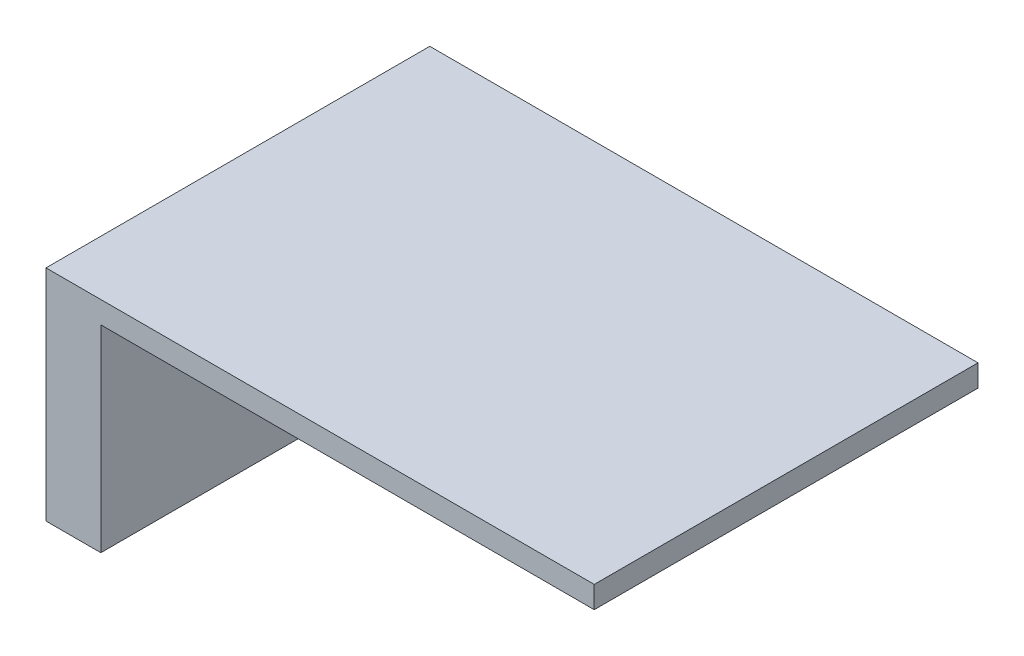
ISO-10303-21;
HEADER;
FILE_DESCRIPTION(('STEP AP214'),'2;1');
FILE_NAME('part.step','',(''),(''),'','','');
FILE_SCHEMA(('AUTOMOTIVE_DESIGN { 1 0 10303 214 1 1 1 1 }'));
ENDSEC;
DATA;
#1=APPLICATION_CONTEXT('core data for automotive mechanical design processes');
#2=APPLICATION_PROTOCOL_DEFINITION('international standard','automotive_design',2000,#1);
#3=PRODUCT_CONTEXT('',#1,'mechanical');
#4=PRODUCT('Part','Part','',(#3));
#5=PRODUCT_RELATED_PRODUCT_CATEGORY('part','',(#4));
#6=PRODUCT_DEFINITION_FORMATION('','',#4);
#7=PRODUCT_DEFINITION_CONTEXT('part definition',#1,'design');
#8=PRODUCT_DEFINITION('design','',#6,#7);
#9=PRODUCT_DEFINITION_SHAPE('','',#8);
#10=(LENGTH_UNIT() NAMED_UNIT(*) SI_UNIT(.MILLI.,.METRE.));
#11=(NAMED_UNIT(*) PLANE_ANGLE_UNIT() SI_UNIT($,.RADIAN.));
#12=(NAMED_UNIT(*) SI_UNIT($,.STERADIAN.) SOLID_ANGLE_UNIT());
#13=UNCERTAINTY_MEASURE_WITH_UNIT(LENGTH_MEASURE(1.E-05),#10,'distance_accuracy_value','');
#14=(GEOMETRIC_REPRESENTATION_CONTEXT(3) GLOBAL_UNCERTAINTY_ASSIGNED_CONTEXT((#13)) GLOBAL_UNIT_ASSIGNED_CONTEXT((#10,
#11,#12)) REPRESENTATION_CONTEXT('',''));
#15=CARTESIAN_POINT('',(0.,0.,0.));
#16=DIRECTION('',(0.,0.,1.));
#17=DIRECTION('',(1.,0.,0.));
#18=AXIS2_PLACEMENT_3D('',#15,#16,#17);
#19=CARTESIAN_POINT('',(2.5,0.,17.5));
#20=DIRECTION('',(0.,1.,0.));
#21=DIRECTION('',(-1.,0.,0.));
#22=AXIS2_PLACEMENT_3D('',#19,#20,#21);
#23=PLANE('',#22);
#24=DIRECTION('',(1.,0.,0.));
#25=VECTOR('',#24,1.);
#26=CARTESIAN_POINT('',(2.5,0.,0.));
#27=LINE('',#26,#25);
#28=CARTESIAN_POINT('',(0.,0.,0.));
#29=VERTEX_POINT('',#28);
#30=CARTESIAN_POINT('',(2.5,0.,0.));
#31=VERTEX_POINT('',#30);
#32=EDGE_CURVE('E116',#29,#31,#27,.T.);
#33=ORIENTED_EDGE('',*,*,#32,.T.);
#34=DIRECTION('',(0.,0.,-1.));
#35=VECTOR('',#34,1.);
#36=CARTESIAN_POINT('',(2.5,0.,17.5));
#37=LINE('',#36,#35);
#38=CARTESIAN_POINT('',(2.5,0.,17.5));
#39=VERTEX_POINT('',#38);
#40=EDGE_CURVE('E11',#39,#31,#37,.T.);
#41=ORIENTED_EDGE('',*,*,#40,.F.);
#42=DIRECTION('',(1.,0.,0.));
#43=VECTOR('',#42,1.);
#44=CARTESIAN_POINT('',(2.5,0.,17.5));
#45=LINE('',#44,#43);
#46=CARTESIAN_POINT('',(0.,0.,17.5));
#47=VERTEX_POINT('',#46);
#48=EDGE_CURVE('E126',#47,#39,#45,.T.);
#49=ORIENTED_EDGE('',*,*,#48,.F.);
#50=DIRECTION('',(0.,0.,-1.));
#51=VECTOR('',#50,1.);
#52=CARTESIAN_POINT('',(0.,0.,17.5));
#53=LINE('',#52,#51);
#54=EDGE_CURVE('E112',#47,#29,#53,.T.);
#55=ORIENTED_EDGE('',*,*,#54,.T.);
#56=EDGE_LOOP('',(#33,#41,#49,#55));
#57=FACE_BOUND('',#56,.T.);
#58=ADVANCED_FACE('F32',(#57),#23,.F.);
#59=CARTESIAN_POINT('',(2.5,9.,17.5));
#60=DIRECTION('',(-1.,0.,0.));
#61=DIRECTION('',(0.,-1.,0.));
#62=AXIS2_PLACEMENT_3D('',#59,#60,#61);
#63=PLANE('',#62);
#64=DIRECTION('',(0.,1.,0.));
#65=VECTOR('',#64,1.);
#66=CARTESIAN_POINT('',(2.5,9.,0.));
#67=LINE('',#66,#65);
#68=CARTESIAN_POINT('',(2.5,9.,0.));
#69=VERTEX_POINT('',#68);
#70=EDGE_CURVE('E119',#31,#69,#67,.T.);
#71=ORIENTED_EDGE('',*,*,#70,.T.);
#72=DIRECTION('',(0.,0.,-1.));
#73=VECTOR('',#72,1.);
#74=CARTESIAN_POINT('',(2.5,9.,17.5));
#75=LINE('',#74,#73);
#76=CARTESIAN_POINT('',(2.5,9.,17.5));
#77=VERTEX_POINT('',#76);
#78=EDGE_CURVE('E40',#77,#69,#75,.T.);
#79=ORIENTED_EDGE('',*,*,#78,.F.);
#80=DIRECTION('',(0.,1.,0.));
#81=VECTOR('',#80,1.);
#82=CARTESIAN_POINT('',(2.5,9.,17.5));
#83=LINE('',#82,#81);
#84=EDGE_CURVE('E85',#39,#77,#83,.T.);
#85=ORIENTED_EDGE('',*,*,#84,.F.);
#86=ORIENTED_EDGE('',*,*,#40,.T.);
#87=EDGE_LOOP('',(#71,#79,#85,#86));
#88=FACE_BOUND('',#87,.T.);
#89=ADVANCED_FACE('F150',(#88),#63,.F.);
#90=CARTESIAN_POINT('',(25.,9.,17.5));
#91=DIRECTION('',(0.,1.,0.));
#92=DIRECTION('',(-1.,0.,0.));
#93=AXIS2_PLACEMENT_3D('',#90,#91,#92);
#94=PLANE('',#93);
#95=DIRECTION('',(1.,0.,0.));
#96=VECTOR('',#95,1.);
#97=CARTESIAN_POINT('',(25.,9.,0.));
#98=LINE('',#97,#96);
#99=CARTESIAN_POINT('',(25.,9.,0.));
#100=VERTEX_POINT('',#99);
#101=EDGE_CURVE('E121',#69,#100,#98,.T.);
#102=ORIENTED_EDGE('',*,*,#101,.T.);
#103=DIRECTION('',(0.,0.,-1.));
#104=VECTOR('',#103,1.);
#105=CARTESIAN_POINT('',(25.,9.,17.5));
#106=LINE('',#105,#104);
#107=CARTESIAN_POINT('',(25.,9.,17.5));
#108=VERTEX_POINT('',#107);
#109=EDGE_CURVE('E107',#108,#100,#106,.T.);
#110=ORIENTED_EDGE('',*,*,#109,.F.);
#111=DIRECTION('',(1.,0.,0.));
#112=VECTOR('',#111,1.);
#113=CARTESIAN_POINT('',(25.,9.,17.5));
#114=LINE('',#113,#112);
#115=EDGE_CURVE('E98',#77,#108,#114,.T.);
#116=ORIENTED_EDGE('',*,*,#115,.F.);
#117=ORIENTED_EDGE('',*,*,#78,.T.);
#118=EDGE_LOOP('',(#102,#110,#116,#117));
#119=FACE_BOUND('',#118,.T.);
#120=ADVANCED_FACE('F132',(#119),#94,.F.);
#121=CARTESIAN_POINT('',(25.,10.,17.5));
#122=DIRECTION('',(-1.,0.,0.));
#123=DIRECTION('',(0.,0.,1.));
#124=AXIS2_PLACEMENT_3D('',#121,#122,#123);
#125=PLANE('',#124);
#126=DIRECTION('',(0.,1.,0.));
#127=VECTOR('',#126,1.);
#128=CARTESIAN_POINT('',(25.,10.,0.));
#129=LINE('',#128,#127);
#130=CARTESIAN_POINT('',(25.,10.,0.));
#131=VERTEX_POINT('',#130);
#132=EDGE_CURVE('E106',#100,#131,#129,.T.);
#133=ORIENTED_EDGE('',*,*,#132,.T.);
#134=DIRECTION('',(0.,0.,-1.));
#135=VECTOR('',#134,1.);
#136=CARTESIAN_POINT('',(25.,10.,17.5));
#137=LINE('',#136,#135);
#138=CARTESIAN_POINT('',(25.,10.,17.5));
#139=VERTEX_POINT('',#138);
#140=EDGE_CURVE('E103',#139,#131,#137,.T.);
#141=ORIENTED_EDGE('',*,*,#140,.F.);
#142=DIRECTION('',(0.,1.,0.));
#143=VECTOR('',#142,1.);
#144=CARTESIAN_POINT('',(25.,10.,17.5));
#145=LINE('',#144,#143);
#146=EDGE_CURVE('E92',#108,#139,#145,.T.);
#147=ORIENTED_EDGE('',*,*,#146,.F.);
#148=ORIENTED_EDGE('',*,*,#109,.T.);
#149=EDGE_LOOP('',(#133,#141,#147,#148));
#150=FACE_BOUND('',#149,.T.);
#151=ADVANCED_FACE('F104',(#150),#125,.F.);
#152=CARTESIAN_POINT('',(0.,10.,17.5));
#153=DIRECTION('',(0.,-1.,0.));
#154=DIRECTION('',(0.,0.,-1.));
#155=AXIS2_PLACEMENT_3D('',#152,#153,#154);
#156=PLANE('',#155);
#157=DIRECTION('',(-1.,0.,0.));
#158=VECTOR('',#157,1.);
#159=CARTESIAN_POINT('',(0.,10.,0.));
#160=LINE('',#159,#158);
#161=CARTESIAN_POINT('',(0.,10.,0.));
#162=VERTEX_POINT('',#161);
#163=EDGE_CURVE('E71',#131,#162,#160,.T.);
#164=ORIENTED_EDGE('',*,*,#163,.T.);
#165=DIRECTION('',(0.,0.,-1.));
#166=VECTOR('',#165,1.);
#167=CARTESIAN_POINT('',(0.,10.,17.5));
#168=LINE('',#167,#166);
#169=CARTESIAN_POINT('',(0.,10.,17.5));
#170=VERTEX_POINT('',#169);
#171=EDGE_CURVE('E108',#170,#162,#168,.T.);
#172=ORIENTED_EDGE('',*,*,#171,.F.);
#173=DIRECTION('',(-1.,0.,0.));
#174=VECTOR('',#173,1.);
#175=CARTESIAN_POINT('',(0.,10.,17.5));
#176=LINE('',#175,#174);
#177=EDGE_CURVE('E96',#139,#170,#176,.T.);
#178=ORIENTED_EDGE('',*,*,#177,.F.);
#179=ORIENTED_EDGE('',*,*,#140,.T.);
#180=EDGE_LOOP('',(#164,#172,#178,#179));
#181=FACE_BOUND('',#180,.T.);
#182=ADVANCED_FACE('F110',(#181),#156,.F.);
#183=CARTESIAN_POINT('',(0.,0.,17.5));
#184=DIRECTION('',(1.,0.,0.));
#185=DIRECTION('',(0.,0.,-1.));
#186=AXIS2_PLACEMENT_3D('',#183,#184,#185);
#187=PLANE('',#186);
#188=DIRECTION('',(0.,-1.,0.));
#189=VECTOR('',#188,1.);
#190=CARTESIAN_POINT('',(0.,0.,0.));
#191=LINE('',#190,#189);
#192=EDGE_CURVE('E77',#162,#29,#191,.T.);
#193=ORIENTED_EDGE('',*,*,#192,.T.);
#194=ORIENTED_EDGE('',*,*,#54,.F.);
#195=DIRECTION('',(0.,-1.,0.));
#196=VECTOR('',#195,1.);
#197=CARTESIAN_POINT('',(0.,0.,17.5));
#198=LINE('',#197,#196);
#199=EDGE_CURVE('E48',#170,#47,#198,.T.);
#200=ORIENTED_EDGE('',*,*,#199,.F.);
#201=ORIENTED_EDGE('',*,*,#171,.T.);
#202=EDGE_LOOP('',(#193,#194,#200,#201));
#203=FACE_BOUND('',#202,.T.);
#204=ADVANCED_FACE('F139',(#203),#187,.F.);
#205=CARTESIAN_POINT('',(0.,0.,17.5));
#206=DIRECTION('',(0.,0.,-1.));
#207=DIRECTION('',(-1.,0.,0.));
#208=AXIS2_PLACEMENT_3D('',#205,#206,#207);
#209=PLANE('',#208);
#210=ORIENTED_EDGE('',*,*,#48,.T.);
#211=ORIENTED_EDGE('',*,*,#84,.T.);
#212=ORIENTED_EDGE('',*,*,#115,.T.);
#213=ORIENTED_EDGE('',*,*,#146,.T.);
#214=ORIENTED_EDGE('',*,*,#177,.T.);
#215=ORIENTED_EDGE('',*,*,#199,.T.);
#216=EDGE_LOOP('',(#210,#211,#212,#213,#214,#215));
#217=FACE_BOUND('',#216,.T.);
#218=ADVANCED_FACE('F94',(#217),#209,.F.);
#219=CARTESIAN_POINT('',(0.,0.,0.));
#220=DIRECTION('',(0.,0.,-1.));
#221=DIRECTION('',(-1.,0.,0.));
#222=AXIS2_PLACEMENT_3D('',#219,#220,#221);
#223=PLANE('',#222);
#224=ORIENTED_EDGE('',*,*,#32,.F.);
#225=ORIENTED_EDGE('',*,*,#192,.F.);
#226=ORIENTED_EDGE('',*,*,#163,.F.);
#227=ORIENTED_EDGE('',*,*,#132,.F.);
#228=ORIENTED_EDGE('',*,*,#101,.F.);
#229=ORIENTED_EDGE('',*,*,#70,.F.);
#230=EDGE_LOOP('',(#224,#225,#226,#227,#228,#229));
#231=FACE_BOUND('',#230,.T.);
#232=ADVANCED_FACE('F135',(#231),#223,.T.);
#233=CLOSED_SHELL('',(#58,#89,#120,#151,#182,#204,#218,#232));
#234=MANIFOLD_SOLID_BREP('B2',#233);
#235=ADVANCED_BREP_SHAPE_REPRESENTATION('',(#18,#234),#14);
#236=SHAPE_DEFINITION_REPRESENTATION(#9,#235);
ENDSEC;
END-ISO-10303-21;
